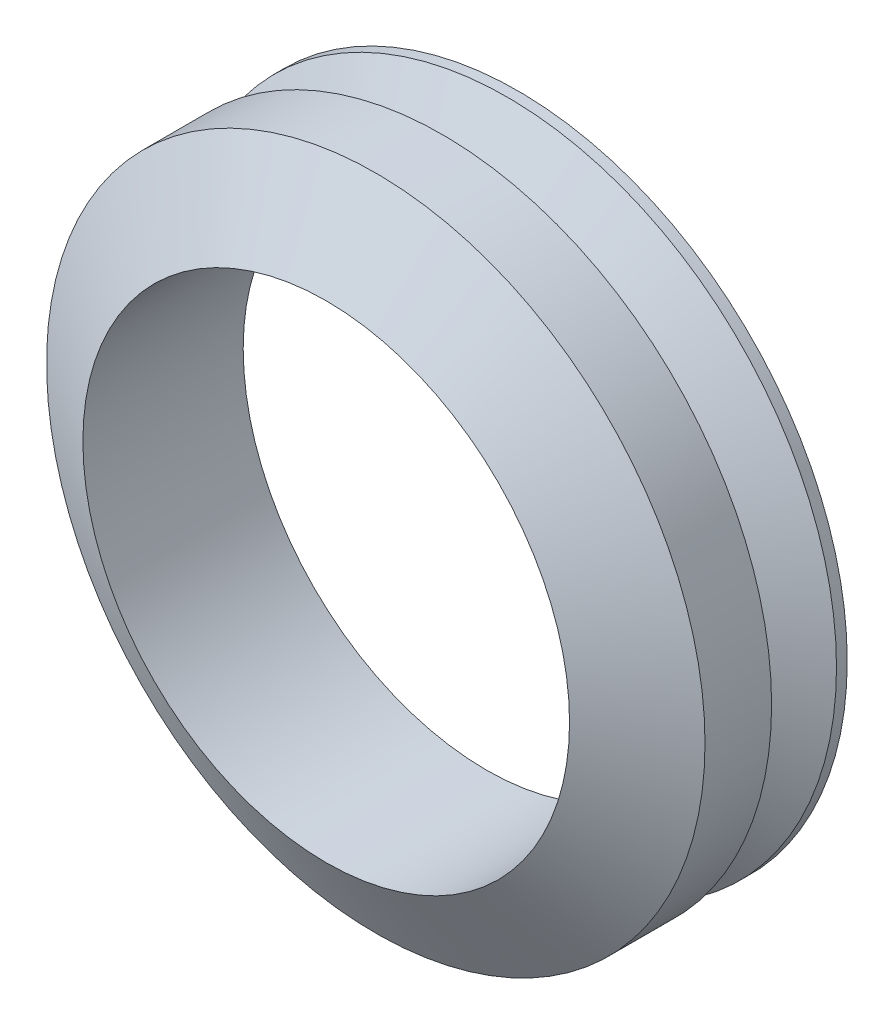
ISO-10303-21;
HEADER;
FILE_DESCRIPTION(('STEP AP214'),'2;1');
FILE_NAME('part.step','',(''),(''),'','','');
FILE_SCHEMA(('AUTOMOTIVE_DESIGN { 1 0 10303 214 1 1 1 1 }'));
ENDSEC;
DATA;
#1=APPLICATION_CONTEXT('core data for automotive mechanical design processes');
#2=APPLICATION_PROTOCOL_DEFINITION('international standard','automotive_design',2000,#1);
#3=PRODUCT_CONTEXT('',#1,'mechanical');
#4=PRODUCT('Part','Part','',(#3));
#5=PRODUCT_RELATED_PRODUCT_CATEGORY('part','',(#4));
#6=PRODUCT_DEFINITION_FORMATION('','',#4);
#7=PRODUCT_DEFINITION_CONTEXT('part definition',#1,'design');
#8=PRODUCT_DEFINITION('design','',#6,#7);
#9=PRODUCT_DEFINITION_SHAPE('','',#8);
#10=(LENGTH_UNIT() NAMED_UNIT(*) SI_UNIT(.MILLI.,.METRE.));
#11=(NAMED_UNIT(*) PLANE_ANGLE_UNIT() SI_UNIT($,.RADIAN.));
#12=(NAMED_UNIT(*) SI_UNIT($,.STERADIAN.) SOLID_ANGLE_UNIT());
#13=UNCERTAINTY_MEASURE_WITH_UNIT(LENGTH_MEASURE(1.E-05),#10,'distance_accuracy_value','');
#14=(GEOMETRIC_REPRESENTATION_CONTEXT(3) GLOBAL_UNCERTAINTY_ASSIGNED_CONTEXT((#13)) GLOBAL_UNIT_ASSIGNED_CONTEXT((#10,
#11,#12)) REPRESENTATION_CONTEXT('',''));
#15=CARTESIAN_POINT('',(0.,0.,0.));
#16=DIRECTION('',(0.,0.,1.));
#17=DIRECTION('',(1.,0.,0.));
#18=AXIS2_PLACEMENT_3D('',#15,#16,#17);
#19=CARTESIAN_POINT('',(0.,0.,-1.73205080756887));
#20=DIRECTION('',(0.,0.,-1.));
#21=DIRECTION('',(-1.,0.,0.));
#22=AXIS2_PLACEMENT_3D('',#19,#20,#21);
#23=CONICAL_SURFACE('',#22,11.5,1.0471975511966);
#24=CARTESIAN_POINT('',(0.,0.,0.));
#25=DIRECTION('',(0.,0.,1.));
#26=DIRECTION('',(1.,0.,0.));
#27=AXIS2_PLACEMENT_3D('',#24,#25,#26);
#28=CIRCLE('',#27,8.5);
#29=CARTESIAN_POINT('',(8.5,0.,0.));
#30=VERTEX_POINT('',#29);
#31=EDGE_CURVE('E55',#30,#30,#28,.T.);
#32=ORIENTED_EDGE('',*,*,#31,.F.);
#33=EDGE_LOOP('',(#32));
#34=FACE_BOUND('',#33,.T.);
#35=CARTESIAN_POINT('',(0.,0.,-1.73205080756887));
#36=DIRECTION('',(0.,0.,1.));
#37=DIRECTION('',(1.,0.,0.));
#38=AXIS2_PLACEMENT_3D('',#35,#36,#37);
#39=CIRCLE('',#38,11.5);
#40=CARTESIAN_POINT('',(11.5,0.,-1.73205080756887));
#41=VERTEX_POINT('',#40);
#42=EDGE_CURVE('E10',#41,#41,#39,.T.);
#43=ORIENTED_EDGE('',*,*,#42,.T.);
#44=EDGE_LOOP('',(#43));
#45=FACE_BOUND('',#44,.T.);
#46=ADVANCED_FACE('F30',(#34,#45),#23,.T.);
#47=CARTESIAN_POINT('',(0.,0.,0.));
#48=DIRECTION('',(0.,0.,1.));
#49=DIRECTION('',(1.,0.,0.));
#50=AXIS2_PLACEMENT_3D('',#47,#48,#49);
#51=CYLINDRICAL_SURFACE('',#50,11.5);
#52=ORIENTED_EDGE('',*,*,#42,.F.);
#53=EDGE_LOOP('',(#52));
#54=FACE_BOUND('',#53,.T.);
#55=CARTESIAN_POINT('',(0.,0.,-4.05820768758089));
#56=DIRECTION('',(0.,0.,1.));
#57=DIRECTION('',(1.,0.,0.));
#58=AXIS2_PLACEMENT_3D('',#55,#56,#57);
#59=CIRCLE('',#58,11.5);
#60=CARTESIAN_POINT('',(11.5,0.,-4.05820768758089));
#61=VERTEX_POINT('',#60);
#62=EDGE_CURVE('E36',#61,#61,#59,.T.);
#63=ORIENTED_EDGE('',*,*,#62,.T.);
#64=EDGE_LOOP('',(#63));
#65=FACE_BOUND('',#64,.T.);
#66=ADVANCED_FACE('F62',(#54,#65),#51,.T.);
#67=CARTESIAN_POINT('',(0.,0.,-4.93173624981976));
#68=DIRECTION('',(0.,0.,1.));
#69=DIRECTION('',(1.,0.,0.));
#70=AXIS2_PLACEMENT_3D('',#67,#68,#69);
#71=CONICAL_SURFACE('',#70,9.1,1.22173047639603);
#72=ORIENTED_EDGE('',*,*,#62,.F.);
#73=EDGE_LOOP('',(#72));
#74=FACE_BOUND('',#73,.T.);
#75=CARTESIAN_POINT('',(0.,0.,-4.93173624981976));
#76=DIRECTION('',(0.,0.,1.));
#77=DIRECTION('',(1.,0.,0.));
#78=AXIS2_PLACEMENT_3D('',#75,#76,#77);
#79=CIRCLE('',#78,9.1);
#80=CARTESIAN_POINT('',(9.1,0.,-4.93173624981976));
#81=VERTEX_POINT('',#80);
#82=EDGE_CURVE('E40',#81,#81,#79,.T.);
#83=ORIENTED_EDGE('',*,*,#82,.T.);
#84=EDGE_LOOP('',(#83));
#85=FACE_BOUND('',#84,.T.);
#86=ADVANCED_FACE('F66',(#74,#85),#71,.T.);
#87=CARTESIAN_POINT('',(0.,0.,-6.325));
#88=DIRECTION('',(0.,0.,-1.));
#89=DIRECTION('',(-1.,0.,0.));
#90=AXIS2_PLACEMENT_3D('',#87,#88,#89);
#91=CONICAL_SURFACE('',#90,11.5,1.04481860759192);
#92=ORIENTED_EDGE('',*,*,#82,.F.);
#93=EDGE_LOOP('',(#92));
#94=FACE_BOUND('',#93,.T.);
#95=CARTESIAN_POINT('',(0.,0.,-6.325));
#96=DIRECTION('',(0.,0.,1.));
#97=DIRECTION('',(1.,0.,0.));
#98=AXIS2_PLACEMENT_3D('',#95,#96,#97);
#99=CIRCLE('',#98,11.5);
#100=CARTESIAN_POINT('',(11.5,0.,-6.325));
#101=VERTEX_POINT('',#100);
#102=EDGE_CURVE('E44',#101,#101,#99,.T.);
#103=ORIENTED_EDGE('',*,*,#102,.T.);
#104=EDGE_LOOP('',(#103));
#105=FACE_BOUND('',#104,.T.);
#106=ADVANCED_FACE('F71',(#94,#105),#91,.T.);
#107=CARTESIAN_POINT('',(0.,0.,0.));
#108=DIRECTION('',(0.,0.,1.));
#109=DIRECTION('',(1.,0.,0.));
#110=AXIS2_PLACEMENT_3D('',#107,#108,#109);
#111=CYLINDRICAL_SURFACE('',#110,11.5);
#112=ORIENTED_EDGE('',*,*,#102,.F.);
#113=EDGE_LOOP('',(#112));
#114=FACE_BOUND('',#113,.T.);
#115=CARTESIAN_POINT('',(0.,0.,-6.7));
#116=DIRECTION('',(0.,0.,1.));
#117=DIRECTION('',(1.,0.,0.));
#118=AXIS2_PLACEMENT_3D('',#115,#116,#117);
#119=CIRCLE('',#118,11.5);
#120=CARTESIAN_POINT('',(11.5,0.,-6.7));
#121=VERTEX_POINT('',#120);
#122=EDGE_CURVE('E49',#121,#121,#119,.T.);
#123=ORIENTED_EDGE('',*,*,#122,.T.);
#124=EDGE_LOOP('',(#123));
#125=FACE_BOUND('',#124,.T.);
#126=ADVANCED_FACE('F77',(#114,#125),#111,.T.);
#127=CARTESIAN_POINT('',(0.,0.,-5.6));
#128=DIRECTION('',(0.,0.,-1.));
#129=DIRECTION('',(-1.,0.,0.));
#130=AXIS2_PLACEMENT_3D('',#127,#128,#129);
#131=CONICAL_SURFACE('',#130,8.5,1.21935153279134);
#132=ORIENTED_EDGE('',*,*,#122,.F.);
#133=EDGE_LOOP('',(#132));
#134=FACE_BOUND('',#133,.T.);
#135=CARTESIAN_POINT('',(0.,0.,-5.6));
#136=DIRECTION('',(0.,0.,1.));
#137=DIRECTION('',(1.,0.,0.));
#138=AXIS2_PLACEMENT_3D('',#135,#136,#137);
#139=CIRCLE('',#138,8.5);
#140=CARTESIAN_POINT('',(8.5,0.,-5.6));
#141=VERTEX_POINT('',#140);
#142=EDGE_CURVE('E52',#141,#141,#139,.T.);
#143=ORIENTED_EDGE('',*,*,#142,.T.);
#144=EDGE_LOOP('',(#143));
#145=FACE_BOUND('',#144,.T.);
#146=ADVANCED_FACE('F81',(#134,#145),#131,.F.);
#147=CARTESIAN_POINT('',(0.,0.,0.));
#148=DIRECTION('',(0.,0.,1.));
#149=DIRECTION('',(1.,0.,0.));
#150=AXIS2_PLACEMENT_3D('',#147,#148,#149);
#151=CYLINDRICAL_SURFACE('',#150,8.5);
#152=ORIENTED_EDGE('',*,*,#142,.F.);
#153=EDGE_LOOP('',(#152));
#154=FACE_BOUND('',#153,.T.);
#155=ORIENTED_EDGE('',*,*,#31,.T.);
#156=EDGE_LOOP('',(#155));
#157=FACE_BOUND('',#156,.T.);
#158=ADVANCED_FACE('F59',(#154,#157),#151,.F.);
#159=CLOSED_SHELL('',(#46,#66,#86,#106,#126,#146,#158));
#160=MANIFOLD_SOLID_BREP('B2',#159);
#161=ADVANCED_BREP_SHAPE_REPRESENTATION('',(#18,#160),#14);
#162=SHAPE_DEFINITION_REPRESENTATION(#9,#161);
ENDSEC;
END-ISO-10303-21;
